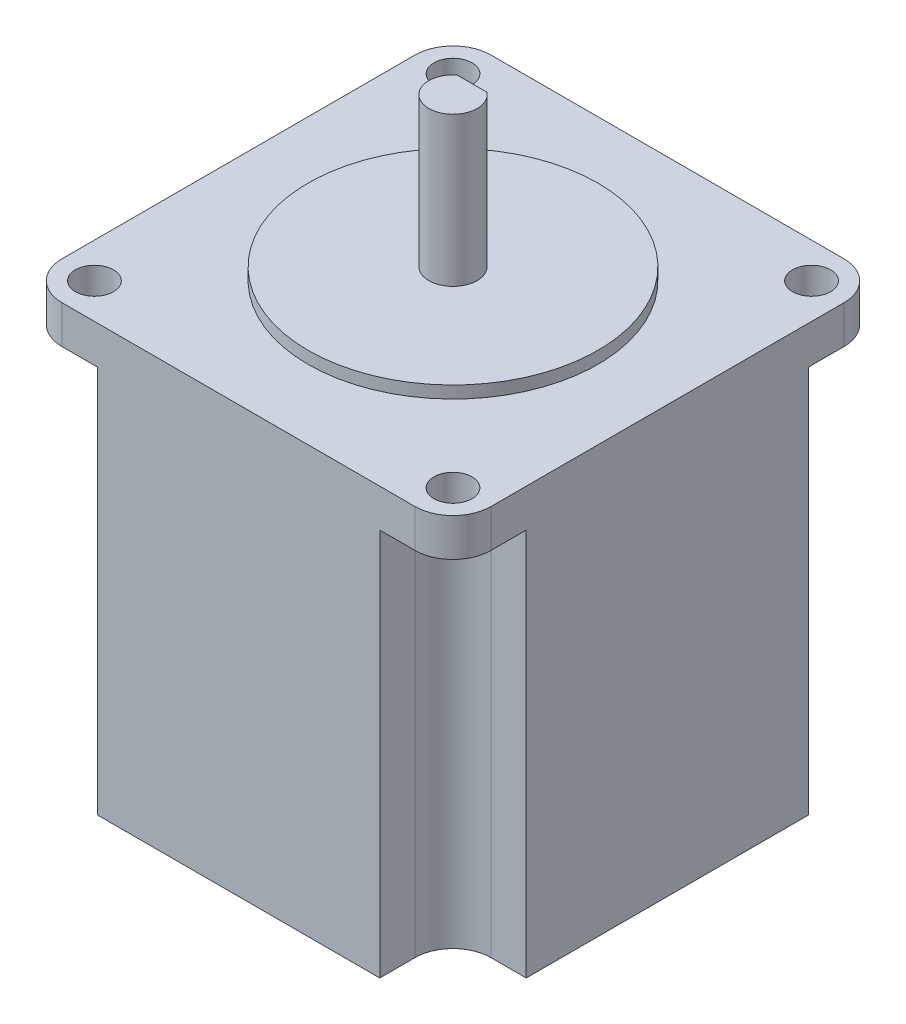
ISO-10303-21;
HEADER;
FILE_DESCRIPTION(('STEP AP214'),'2;1');
FILE_NAME('part.step','',(''),(''),'','','');
FILE_SCHEMA(('AUTOMOTIVE_DESIGN { 1 0 10303 214 1 1 1 1 }'));
ENDSEC;
DATA;
#1=APPLICATION_CONTEXT('core data for automotive mechanical design processes');
#2=APPLICATION_PROTOCOL_DEFINITION('international standard','automotive_design',2000,#1);
#3=PRODUCT_CONTEXT('',#1,'mechanical');
#4=PRODUCT('Part','Part','',(#3));
#5=PRODUCT_RELATED_PRODUCT_CATEGORY('part','',(#4));
#6=PRODUCT_DEFINITION_FORMATION('','',#4);
#7=PRODUCT_DEFINITION_CONTEXT('part definition',#1,'design');
#8=PRODUCT_DEFINITION('design','',#6,#7);
#9=PRODUCT_DEFINITION_SHAPE('','',#8);
#10=(LENGTH_UNIT() NAMED_UNIT(*) SI_UNIT(.MILLI.,.METRE.));
#11=(NAMED_UNIT(*) PLANE_ANGLE_UNIT() SI_UNIT($,.RADIAN.));
#12=(NAMED_UNIT(*) SI_UNIT($,.STERADIAN.) SOLID_ANGLE_UNIT());
#13=UNCERTAINTY_MEASURE_WITH_UNIT(LENGTH_MEASURE(1.E-05),#10,'distance_accuracy_value','');
#14=(GEOMETRIC_REPRESENTATION_CONTEXT(3) GLOBAL_UNCERTAINTY_ASSIGNED_CONTEXT((#13)) GLOBAL_UNIT_ASSIGNED_CONTEXT((#10,
#11,#12)) REPRESENTATION_CONTEXT('',''));
#15=CARTESIAN_POINT('',(0.,0.,0.));
#16=DIRECTION('',(0.,0.,1.));
#17=DIRECTION('',(1.,0.,0.));
#18=AXIS2_PLACEMENT_3D('',#15,#16,#17);
#19=CARTESIAN_POINT('',(-23.57,0.,-23.57));
#20=DIRECTION('',(0.,1.,0.));
#21=DIRECTION('',(0.,0.,1.));
#22=AXIS2_PLACEMENT_3D('',#19,#20,#21);
#23=CYLINDRICAL_SURFACE('',#22,2.5);
#24=CARTESIAN_POINT('',(-23.57,56.,-23.57));
#25=DIRECTION('',(0.,1.,0.));
#26=DIRECTION('',(0.,0.,1.));
#27=AXIS2_PLACEMENT_3D('',#24,#25,#26);
#28=CIRCLE('',#27,2.5);
#29=CARTESIAN_POINT('',(-23.57,56.,-21.07));
#30=VERTEX_POINT('',#29);
#31=EDGE_CURVE('E369',#30,#30,#28,.T.);
#32=ORIENTED_EDGE('',*,*,#31,.T.);
#33=EDGE_LOOP('',(#32));
#34=FACE_BOUND('',#33,.T.);
#35=CARTESIAN_POINT('',(-23.57,51.,-23.57));
#36=DIRECTION('',(0.,-1.,0.));
#37=DIRECTION('',(0.,0.,-1.));
#38=AXIS2_PLACEMENT_3D('',#35,#36,#37);
#39=CIRCLE('',#38,2.5);
#40=CARTESIAN_POINT('',(-23.57,51.,-26.07));
#41=VERTEX_POINT('',#40);
#42=EDGE_CURVE('E376',#41,#41,#39,.F.);
#43=ORIENTED_EDGE('',*,*,#42,.F.);
#44=EDGE_LOOP('',(#43));
#45=FACE_BOUND('',#44,.T.);
#46=ADVANCED_FACE('F42',(#34,#45),#23,.F.);
#47=CARTESIAN_POINT('',(23.57,0.,-23.57));
#48=DIRECTION('',(0.,1.,0.));
#49=DIRECTION('',(0.,0.,1.));
#50=AXIS2_PLACEMENT_3D('',#47,#48,#49);
#51=CYLINDRICAL_SURFACE('',#50,2.5);
#52=CARTESIAN_POINT('',(23.57,56.,-23.57));
#53=DIRECTION('',(0.,1.,0.));
#54=DIRECTION('',(0.,0.,1.));
#55=AXIS2_PLACEMENT_3D('',#52,#53,#54);
#56=CIRCLE('',#55,2.5);
#57=CARTESIAN_POINT('',(23.57,56.,-21.07));
#58=VERTEX_POINT('',#57);
#59=EDGE_CURVE('E366',#58,#58,#56,.T.);
#60=ORIENTED_EDGE('',*,*,#59,.T.);
#61=EDGE_LOOP('',(#60));
#62=FACE_BOUND('',#61,.T.);
#63=CARTESIAN_POINT('',(23.57,51.,-23.57));
#64=DIRECTION('',(0.,-1.,0.));
#65=DIRECTION('',(0.,0.,-1.));
#66=AXIS2_PLACEMENT_3D('',#63,#64,#65);
#67=CIRCLE('',#66,2.5);
#68=CARTESIAN_POINT('',(23.57,51.,-26.07));
#69=VERTEX_POINT('',#68);
#70=EDGE_CURVE('E409',#69,#69,#67,.F.);
#71=ORIENTED_EDGE('',*,*,#70,.F.);
#72=EDGE_LOOP('',(#71));
#73=FACE_BOUND('',#72,.T.);
#74=ADVANCED_FACE('F550',(#62,#73),#51,.F.);
#75=CARTESIAN_POINT('',(23.57,0.,23.57));
#76=DIRECTION('',(0.,1.,0.));
#77=DIRECTION('',(0.,0.,1.));
#78=AXIS2_PLACEMENT_3D('',#75,#76,#77);
#79=CYLINDRICAL_SURFACE('',#78,2.5);
#80=CARTESIAN_POINT('',(23.57,56.,23.57));
#81=DIRECTION('',(0.,1.,0.));
#82=DIRECTION('',(0.,0.,1.));
#83=AXIS2_PLACEMENT_3D('',#80,#81,#82);
#84=CIRCLE('',#83,2.5);
#85=CARTESIAN_POINT('',(23.57,56.,26.07));
#86=VERTEX_POINT('',#85);
#87=EDGE_CURVE('E370',#86,#86,#84,.T.);
#88=ORIENTED_EDGE('',*,*,#87,.T.);
#89=EDGE_LOOP('',(#88));
#90=FACE_BOUND('',#89,.T.);
#91=CARTESIAN_POINT('',(23.57,51.,23.57));
#92=DIRECTION('',(0.,-1.,0.));
#93=DIRECTION('',(0.,0.,-1.));
#94=AXIS2_PLACEMENT_3D('',#91,#92,#93);
#95=CIRCLE('',#94,2.5);
#96=CARTESIAN_POINT('',(23.57,51.,21.07));
#97=VERTEX_POINT('',#96);
#98=EDGE_CURVE('E406',#97,#97,#95,.F.);
#99=ORIENTED_EDGE('',*,*,#98,.F.);
#100=EDGE_LOOP('',(#99));
#101=FACE_BOUND('',#100,.T.);
#102=ADVANCED_FACE('F556',(#90,#101),#79,.F.);
#103=CARTESIAN_POINT('',(-23.57,0.,23.57));
#104=DIRECTION('',(0.,1.,0.));
#105=DIRECTION('',(0.,0.,1.));
#106=AXIS2_PLACEMENT_3D('',#103,#104,#105);
#107=CYLINDRICAL_SURFACE('',#106,2.5);
#108=CARTESIAN_POINT('',(-23.57,56.,23.57));
#109=DIRECTION('',(0.,1.,0.));
#110=DIRECTION('',(0.,0.,1.));
#111=AXIS2_PLACEMENT_3D('',#108,#109,#110);
#112=CIRCLE('',#111,2.5);
#113=CARTESIAN_POINT('',(-23.57,56.,26.07));
#114=VERTEX_POINT('',#113);
#115=EDGE_CURVE('E373',#114,#114,#112,.T.);
#116=ORIENTED_EDGE('',*,*,#115,.T.);
#117=EDGE_LOOP('',(#116));
#118=FACE_BOUND('',#117,.T.);
#119=CARTESIAN_POINT('',(-23.57,51.,23.57));
#120=DIRECTION('',(0.,-1.,0.));
#121=DIRECTION('',(0.,0.,-1.));
#122=AXIS2_PLACEMENT_3D('',#119,#120,#121);
#123=CIRCLE('',#122,2.5);
#124=CARTESIAN_POINT('',(-23.57,51.,21.07));
#125=VERTEX_POINT('',#124);
#126=EDGE_CURVE('E360',#125,#125,#123,.F.);
#127=ORIENTED_EDGE('',*,*,#126,.F.);
#128=EDGE_LOOP('',(#127));
#129=FACE_BOUND('',#128,.T.);
#130=ADVANCED_FACE('F561',(#118,#129),#107,.F.);
#131=CARTESIAN_POINT('',(28.2,56.,28.2));
#132=DIRECTION('',(-1.,0.,0.));
#133=DIRECTION('',(0.,0.,1.));
#134=AXIS2_PLACEMENT_3D('',#131,#132,#133);
#135=PLANE('',#134);
#136=DIRECTION('',(0.,0.,1.));
#137=VECTOR('',#136,1.);
#138=CARTESIAN_POINT('',(28.2,51.,-18.57));
#139=LINE('',#138,#137);
#140=CARTESIAN_POINT('',(28.2,51.,-23.2));
#141=VERTEX_POINT('',#140);
#142=CARTESIAN_POINT('',(28.2,51.,-18.57));
#143=VERTEX_POINT('',#142);
#144=EDGE_CURVE('E318',#141,#143,#139,.T.);
#145=ORIENTED_EDGE('',*,*,#144,.F.);
#146=DIRECTION('',(0.,-1.,0.));
#147=VECTOR('',#146,1.);
#148=CARTESIAN_POINT('',(28.2,56.,-23.2));
#149=LINE('',#148,#147);
#150=CARTESIAN_POINT('',(28.2,56.,-23.2));
#151=VERTEX_POINT('',#150);
#152=EDGE_CURVE('E423',#141,#151,#149,.F.);
#153=ORIENTED_EDGE('',*,*,#152,.T.);
#154=DIRECTION('',(0.,0.,-1.));
#155=VECTOR('',#154,1.);
#156=CARTESIAN_POINT('',(28.2,56.,28.2));
#157=LINE('',#156,#155);
#158=CARTESIAN_POINT('',(28.2,56.,23.2));
#159=VERTEX_POINT('',#158);
#160=EDGE_CURVE('E380',#159,#151,#157,.T.);
#161=ORIENTED_EDGE('',*,*,#160,.F.);
#162=DIRECTION('',(0.,-1.,0.));
#163=VECTOR('',#162,1.);
#164=CARTESIAN_POINT('',(28.2,56.,23.2));
#165=LINE('',#164,#163);
#166=CARTESIAN_POINT('',(28.2,51.,23.2));
#167=VERTEX_POINT('',#166);
#168=EDGE_CURVE('E420',#159,#167,#165,.T.);
#169=ORIENTED_EDGE('',*,*,#168,.T.);
#170=DIRECTION('',(0.,0.,1.));
#171=VECTOR('',#170,1.);
#172=CARTESIAN_POINT('',(28.2,51.,28.2));
#173=LINE('',#172,#171);
#174=CARTESIAN_POINT('',(28.2,51.,18.57));
#175=VERTEX_POINT('',#174);
#176=EDGE_CURVE('E347',#175,#167,#173,.T.);
#177=ORIENTED_EDGE('',*,*,#176,.F.);
#178=DIRECTION('',(0.,-1.,0.));
#179=VECTOR('',#178,1.);
#180=CARTESIAN_POINT('',(28.2,51.,18.57));
#181=LINE('',#180,#179);
#182=CARTESIAN_POINT('',(28.2,0.,18.57));
#183=VERTEX_POINT('',#182);
#184=EDGE_CURVE('E357',#175,#183,#181,.T.);
#185=ORIENTED_EDGE('',*,*,#184,.T.);
#186=DIRECTION('',(0.,0.,-1.));
#187=VECTOR('',#186,1.);
#188=CARTESIAN_POINT('',(28.2,0.,28.2));
#189=LINE('',#188,#187);
#190=CARTESIAN_POINT('',(28.2,0.,-18.57));
#191=VERTEX_POINT('',#190);
#192=EDGE_CURVE('E379',#183,#191,#189,.T.);
#193=ORIENTED_EDGE('',*,*,#192,.T.);
#194=DIRECTION('',(0.,-1.,0.));
#195=VECTOR('',#194,1.);
#196=CARTESIAN_POINT('',(28.2,51.,-18.57));
#197=LINE('',#196,#195);
#198=EDGE_CURVE('E306',#143,#191,#197,.T.);
#199=ORIENTED_EDGE('',*,*,#198,.F.);
#200=EDGE_LOOP('',(#145,#153,#161,#169,#177,#185,#193,#199));
#201=FACE_BOUND('',#200,.T.);
#202=ADVANCED_FACE('F522',(#201),#135,.F.);
#203=CARTESIAN_POINT('',(-28.2,56.,-28.2));
#204=DIRECTION('',(0.,0.,1.));
#205=DIRECTION('',(1.,0.,0.));
#206=AXIS2_PLACEMENT_3D('',#203,#204,#205);
#207=PLANE('',#206);
#208=DIRECTION('',(-1.,0.,0.));
#209=VECTOR('',#208,1.);
#210=CARTESIAN_POINT('',(-28.2,56.,-28.2));
#211=LINE('',#210,#209);
#212=CARTESIAN_POINT('',(23.2,56.,-28.2));
#213=VERTEX_POINT('',#212);
#214=CARTESIAN_POINT('',(-23.2,56.,-28.2));
#215=VERTEX_POINT('',#214);
#216=EDGE_CURVE('E383',#213,#215,#211,.T.);
#217=ORIENTED_EDGE('',*,*,#216,.F.);
#218=DIRECTION('',(0.,-1.,0.));
#219=VECTOR('',#218,1.);
#220=CARTESIAN_POINT('',(23.2,56.,-28.2));
#221=LINE('',#220,#219);
#222=CARTESIAN_POINT('',(23.2,51.,-28.2));
#223=VERTEX_POINT('',#222);
#224=EDGE_CURVE('E415',#213,#223,#221,.T.);
#225=ORIENTED_EDGE('',*,*,#224,.T.);
#226=DIRECTION('',(1.,0.,0.));
#227=VECTOR('',#226,1.);
#228=CARTESIAN_POINT('',(28.2,51.,-28.2));
#229=LINE('',#228,#227);
#230=CARTESIAN_POINT('',(18.57,51.,-28.2));
#231=VERTEX_POINT('',#230);
#232=EDGE_CURVE('E308',#231,#223,#229,.T.);
#233=ORIENTED_EDGE('',*,*,#232,.F.);
#234=DIRECTION('',(0.,-1.,0.));
#235=VECTOR('',#234,1.);
#236=CARTESIAN_POINT('',(18.57,51.,-28.2));
#237=LINE('',#236,#235);
#238=CARTESIAN_POINT('',(18.57,0.,-28.2));
#239=VERTEX_POINT('',#238);
#240=EDGE_CURVE('E260',#231,#239,#237,.T.);
#241=ORIENTED_EDGE('',*,*,#240,.T.);
#242=DIRECTION('',(-1.,0.,0.));
#243=VECTOR('',#242,1.);
#244=CARTESIAN_POINT('',(-28.2,0.,-28.2));
#245=LINE('',#244,#243);
#246=CARTESIAN_POINT('',(-18.57,0.,-28.2));
#247=VERTEX_POINT('',#246);
#248=EDGE_CURVE('E396',#239,#247,#245,.T.);
#249=ORIENTED_EDGE('',*,*,#248,.T.);
#250=DIRECTION('',(0.,-1.,0.));
#251=VECTOR('',#250,1.);
#252=CARTESIAN_POINT('',(-18.57,51.,-28.2));
#253=LINE('',#252,#251);
#254=CARTESIAN_POINT('',(-18.57,51.,-28.2));
#255=VERTEX_POINT('',#254);
#256=EDGE_CURVE('E242',#255,#247,#253,.T.);
#257=ORIENTED_EDGE('',*,*,#256,.F.);
#258=DIRECTION('',(1.,0.,0.));
#259=VECTOR('',#258,1.);
#260=CARTESIAN_POINT('',(-18.57,51.,-28.2));
#261=LINE('',#260,#259);
#262=CARTESIAN_POINT('',(-23.2,51.,-28.2));
#263=VERTEX_POINT('',#262);
#264=EDGE_CURVE('E254',#263,#255,#261,.T.);
#265=ORIENTED_EDGE('',*,*,#264,.F.);
#266=DIRECTION('',(0.,-1.,0.));
#267=VECTOR('',#266,1.);
#268=CARTESIAN_POINT('',(-23.2,56.,-28.2));
#269=LINE('',#268,#267);
#270=EDGE_CURVE('E393',#263,#215,#269,.F.);
#271=ORIENTED_EDGE('',*,*,#270,.T.);
#272=EDGE_LOOP('',(#217,#225,#233,#241,#249,#257,#265,#271));
#273=FACE_BOUND('',#272,.T.);
#274=ADVANCED_FACE('F478',(#273),#207,.F.);
#275=CARTESIAN_POINT('',(-28.2,56.,28.2));
#276=DIRECTION('',(1.,0.,0.));
#277=DIRECTION('',(0.,0.,-1.));
#278=AXIS2_PLACEMENT_3D('',#275,#276,#277);
#279=PLANE('',#278);
#280=DIRECTION('',(0.,0.,1.));
#281=VECTOR('',#280,1.);
#282=CARTESIAN_POINT('',(-28.2,56.,28.2));
#283=LINE('',#282,#281);
#284=CARTESIAN_POINT('',(-28.2,56.,-23.2));
#285=VERTEX_POINT('',#284);
#286=CARTESIAN_POINT('',(-28.2,56.,23.2));
#287=VERTEX_POINT('',#286);
#288=EDGE_CURVE('E387',#285,#287,#283,.T.);
#289=ORIENTED_EDGE('',*,*,#288,.F.);
#290=DIRECTION('',(0.,-1.,0.));
#291=VECTOR('',#290,1.);
#292=CARTESIAN_POINT('',(-28.2,56.,-23.2));
#293=LINE('',#292,#291);
#294=CARTESIAN_POINT('',(-28.2,51.,-23.2));
#295=VERTEX_POINT('',#294);
#296=EDGE_CURVE('E435',#285,#295,#293,.T.);
#297=ORIENTED_EDGE('',*,*,#296,.T.);
#298=DIRECTION('',(0.,0.,-1.));
#299=VECTOR('',#298,1.);
#300=CARTESIAN_POINT('',(-28.2,51.,-28.2));
#301=LINE('',#300,#299);
#302=CARTESIAN_POINT('',(-28.2,51.,-18.57));
#303=VERTEX_POINT('',#302);
#304=EDGE_CURVE('E244',#303,#295,#301,.T.);
#305=ORIENTED_EDGE('',*,*,#304,.F.);
#306=DIRECTION('',(0.,-1.,0.));
#307=VECTOR('',#306,1.);
#308=CARTESIAN_POINT('',(-28.2,51.,-18.57));
#309=LINE('',#308,#307);
#310=CARTESIAN_POINT('',(-28.2,0.,-18.57));
#311=VERTEX_POINT('',#310);
#312=EDGE_CURVE('E241',#303,#311,#309,.T.);
#313=ORIENTED_EDGE('',*,*,#312,.T.);
#314=DIRECTION('',(0.,0.,1.));
#315=VECTOR('',#314,1.);
#316=CARTESIAN_POINT('',(-28.2,0.,28.2));
#317=LINE('',#316,#315);
#318=CARTESIAN_POINT('',(-28.2,0.,18.57));
#319=VERTEX_POINT('',#318);
#320=EDGE_CURVE('E399',#311,#319,#317,.T.);
#321=ORIENTED_EDGE('',*,*,#320,.T.);
#322=DIRECTION('',(0.,-1.,0.));
#323=VECTOR('',#322,1.);
#324=CARTESIAN_POINT('',(-28.2,51.,18.57));
#325=LINE('',#324,#323);
#326=CARTESIAN_POINT('',(-28.2,51.,18.57));
#327=VERTEX_POINT('',#326);
#328=EDGE_CURVE('E273',#327,#319,#325,.T.);
#329=ORIENTED_EDGE('',*,*,#328,.F.);
#330=DIRECTION('',(0.,0.,-1.));
#331=VECTOR('',#330,1.);
#332=CARTESIAN_POINT('',(-28.2,51.,18.57));
#333=LINE('',#332,#331);
#334=CARTESIAN_POINT('',(-28.2,51.,23.2));
#335=VERTEX_POINT('',#334);
#336=EDGE_CURVE('E302',#335,#327,#333,.T.);
#337=ORIENTED_EDGE('',*,*,#336,.F.);
#338=DIRECTION('',(0.,-1.,0.));
#339=VECTOR('',#338,1.);
#340=CARTESIAN_POINT('',(-28.2,56.,23.2));
#341=LINE('',#340,#339);
#342=EDGE_CURVE('E433',#335,#287,#341,.F.);
#343=ORIENTED_EDGE('',*,*,#342,.T.);
#344=EDGE_LOOP('',(#289,#297,#305,#313,#321,#329,#337,#343));
#345=FACE_BOUND('',#344,.T.);
#346=ADVANCED_FACE('F510',(#345),#279,.F.);
#347=CARTESIAN_POINT('',(-28.2,56.,28.2));
#348=DIRECTION('',(0.,0.,-1.));
#349=DIRECTION('',(-1.,0.,0.));
#350=AXIS2_PLACEMENT_3D('',#347,#348,#349);
#351=PLANE('',#350);
#352=DIRECTION('',(-1.,0.,0.));
#353=VECTOR('',#352,1.);
#354=CARTESIAN_POINT('',(18.57,51.,28.2));
#355=LINE('',#354,#353);
#356=CARTESIAN_POINT('',(23.2,51.,28.2));
#357=VERTEX_POINT('',#356);
#358=CARTESIAN_POINT('',(18.57,51.,28.2));
#359=VERTEX_POINT('',#358);
#360=EDGE_CURVE('E335',#357,#359,#355,.T.);
#361=ORIENTED_EDGE('',*,*,#360,.F.);
#362=DIRECTION('',(0.,-1.,0.));
#363=VECTOR('',#362,1.);
#364=CARTESIAN_POINT('',(23.2,56.,28.2));
#365=LINE('',#364,#363);
#366=CARTESIAN_POINT('',(23.2,56.,28.2));
#367=VERTEX_POINT('',#366);
#368=EDGE_CURVE('E444',#357,#367,#365,.F.);
#369=ORIENTED_EDGE('',*,*,#368,.T.);
#370=DIRECTION('',(1.,0.,0.));
#371=VECTOR('',#370,1.);
#372=CARTESIAN_POINT('',(-28.2,56.,28.2));
#373=LINE('',#372,#371);
#374=CARTESIAN_POINT('',(-23.2,56.,28.2));
#375=VERTEX_POINT('',#374);
#376=EDGE_CURVE('E390',#375,#367,#373,.T.);
#377=ORIENTED_EDGE('',*,*,#376,.F.);
#378=DIRECTION('',(0.,-1.,0.));
#379=VECTOR('',#378,1.);
#380=CARTESIAN_POINT('',(-23.2,56.,28.2));
#381=LINE('',#380,#379);
#382=CARTESIAN_POINT('',(-23.2,51.,28.2));
#383=VERTEX_POINT('',#382);
#384=EDGE_CURVE('E442',#375,#383,#381,.T.);
#385=ORIENTED_EDGE('',*,*,#384,.T.);
#386=DIRECTION('',(-1.,0.,0.));
#387=VECTOR('',#386,1.);
#388=CARTESIAN_POINT('',(-28.2,51.,28.2));
#389=LINE('',#388,#387);
#390=CARTESIAN_POINT('',(-18.57,51.,28.2));
#391=VERTEX_POINT('',#390);
#392=EDGE_CURVE('E287',#391,#383,#389,.T.);
#393=ORIENTED_EDGE('',*,*,#392,.F.);
#394=DIRECTION('',(0.,-1.,0.));
#395=VECTOR('',#394,1.);
#396=CARTESIAN_POINT('',(-18.57,51.,28.2));
#397=LINE('',#396,#395);
#398=CARTESIAN_POINT('',(-18.57,0.,28.2));
#399=VERTEX_POINT('',#398);
#400=EDGE_CURVE('E280',#391,#399,#397,.T.);
#401=ORIENTED_EDGE('',*,*,#400,.T.);
#402=DIRECTION('',(1.,0.,0.));
#403=VECTOR('',#402,1.);
#404=CARTESIAN_POINT('',(-28.2,0.,28.2));
#405=LINE('',#404,#403);
#406=CARTESIAN_POINT('',(18.57,0.,28.2));
#407=VERTEX_POINT('',#406);
#408=EDGE_CURVE('E384',#399,#407,#405,.T.);
#409=ORIENTED_EDGE('',*,*,#408,.T.);
#410=DIRECTION('',(0.,-1.,0.));
#411=VECTOR('',#410,1.);
#412=CARTESIAN_POINT('',(18.57,51.,28.2));
#413=LINE('',#412,#411);
#414=EDGE_CURVE('E350',#359,#407,#413,.T.);
#415=ORIENTED_EDGE('',*,*,#414,.F.);
#416=EDGE_LOOP('',(#361,#369,#377,#385,#393,#401,#409,#415));
#417=FACE_BOUND('',#416,.T.);
#418=ADVANCED_FACE('F456',(#417),#351,.F.);
#419=CARTESIAN_POINT('',(0.,56.,0.));
#420=DIRECTION('',(0.,-1.,0.));
#421=DIRECTION('',(0.,0.,-1.));
#422=AXIS2_PLACEMENT_3D('',#419,#420,#421);
#423=PLANE('',#422);
#424=CARTESIAN_POINT('',(0.,56.,0.));
#425=DIRECTION('',(0.,-1.,0.));
#426=DIRECTION('',(0.,0.,-1.));
#427=AXIS2_PLACEMENT_3D('',#424,#425,#426);
#428=CIRCLE('',#427,19.05);
#429=CARTESIAN_POINT('',(0.,56.,-19.05));
#430=VERTEX_POINT('',#429);
#431=EDGE_CURVE('E46',#430,#430,#428,.F.);
#432=ORIENTED_EDGE('',*,*,#431,.F.);
#433=EDGE_LOOP('',(#432));
#434=FACE_BOUND('',#433,.T.);
#435=ORIENTED_EDGE('',*,*,#115,.F.);
#436=EDGE_LOOP('',(#435));
#437=FACE_BOUND('',#436,.T.);
#438=ORIENTED_EDGE('',*,*,#87,.F.);
#439=EDGE_LOOP('',(#438));
#440=FACE_BOUND('',#439,.T.);
#441=ORIENTED_EDGE('',*,*,#59,.F.);
#442=EDGE_LOOP('',(#441));
#443=FACE_BOUND('',#442,.T.);
#444=ORIENTED_EDGE('',*,*,#31,.F.);
#445=EDGE_LOOP('',(#444));
#446=FACE_BOUND('',#445,.T.);
#447=ORIENTED_EDGE('',*,*,#160,.T.);
#448=CARTESIAN_POINT('',(23.2,56.,-23.2));
#449=DIRECTION('',(0.,-1.,0.));
#450=DIRECTION('',(0.,0.,-1.));
#451=AXIS2_PLACEMENT_3D('',#448,#449,#450);
#452=CIRCLE('',#451,5.);
#453=EDGE_CURVE('E431',#151,#213,#452,.F.);
#454=ORIENTED_EDGE('',*,*,#453,.T.);
#455=ORIENTED_EDGE('',*,*,#216,.T.);
#456=CARTESIAN_POINT('',(-23.2,56.,-23.2));
#457=DIRECTION('',(0.,-1.,0.));
#458=DIRECTION('',(0.,0.,-1.));
#459=AXIS2_PLACEMENT_3D('',#456,#457,#458);
#460=CIRCLE('',#459,5.);
#461=EDGE_CURVE('E429',#215,#285,#460,.F.);
#462=ORIENTED_EDGE('',*,*,#461,.T.);
#463=ORIENTED_EDGE('',*,*,#288,.T.);
#464=CARTESIAN_POINT('',(-23.2,56.,23.2));
#465=DIRECTION('',(0.,-1.,0.));
#466=DIRECTION('',(0.,0.,-1.));
#467=AXIS2_PLACEMENT_3D('',#464,#465,#466);
#468=CIRCLE('',#467,5.);
#469=EDGE_CURVE('E425',#287,#375,#468,.F.);
#470=ORIENTED_EDGE('',*,*,#469,.T.);
#471=ORIENTED_EDGE('',*,*,#376,.T.);
#472=CARTESIAN_POINT('',(23.2,56.,23.2));
#473=DIRECTION('',(0.,-1.,0.));
#474=DIRECTION('',(0.,0.,-1.));
#475=AXIS2_PLACEMENT_3D('',#472,#473,#474);
#476=CIRCLE('',#475,5.);
#477=EDGE_CURVE('E427',#367,#159,#476,.F.);
#478=ORIENTED_EDGE('',*,*,#477,.T.);
#479=EDGE_LOOP('',(#447,#454,#455,#462,#463,#470,#471,#478));
#480=FACE_BOUND('',#479,.T.);
#481=ADVANCED_FACE('F452',(#434,#437,#440,#443,#446,#480),#423,.F.);
#482=CARTESIAN_POINT('',(0.,0.,0.));
#483=DIRECTION('',(0.,-1.,0.));
#484=DIRECTION('',(0.,0.,-1.));
#485=AXIS2_PLACEMENT_3D('',#482,#483,#484);
#486=PLANE('',#485);
#487=DIRECTION('',(0.,0.,1.));
#488=VECTOR('',#487,1.);
#489=CARTESIAN_POINT('',(-18.57,0.,23.57));
#490=LINE('',#489,#488);
#491=CARTESIAN_POINT('',(-18.57,0.,23.57));
#492=VERTEX_POINT('',#491);
#493=EDGE_CURVE('E284',#492,#399,#490,.T.);
#494=ORIENTED_EDGE('',*,*,#493,.F.);
#495=CARTESIAN_POINT('',(-23.57,0.,23.57));
#496=DIRECTION('',(0.,-1.,0.));
#497=DIRECTION('',(0.,0.,-1.));
#498=AXIS2_PLACEMENT_3D('',#495,#496,#497);
#499=CIRCLE('',#498,5.);
#500=CARTESIAN_POINT('',(-23.57,0.,18.57));
#501=VERTEX_POINT('',#500);
#502=EDGE_CURVE('E286',#501,#492,#499,.T.);
#503=ORIENTED_EDGE('',*,*,#502,.F.);
#504=DIRECTION('',(1.,0.,0.));
#505=VECTOR('',#504,1.);
#506=CARTESIAN_POINT('',(-23.57,0.,18.57));
#507=LINE('',#506,#505);
#508=EDGE_CURVE('E290',#319,#501,#507,.T.);
#509=ORIENTED_EDGE('',*,*,#508,.F.);
#510=ORIENTED_EDGE('',*,*,#320,.F.);
#511=DIRECTION('',(-1.,0.,0.));
#512=VECTOR('',#511,1.);
#513=CARTESIAN_POINT('',(-23.57,0.,-18.57));
#514=LINE('',#513,#512);
#515=CARTESIAN_POINT('',(-23.57,0.,-18.57));
#516=VERTEX_POINT('',#515);
#517=EDGE_CURVE('E251',#516,#311,#514,.T.);
#518=ORIENTED_EDGE('',*,*,#517,.F.);
#519=CARTESIAN_POINT('',(-23.57,0.,-23.57));
#520=DIRECTION('',(0.,-1.,0.));
#521=DIRECTION('',(0.,0.,-1.));
#522=AXIS2_PLACEMENT_3D('',#519,#520,#521);
#523=CIRCLE('',#522,5.);
#524=CARTESIAN_POINT('',(-18.57,0.,-23.57));
#525=VERTEX_POINT('',#524);
#526=EDGE_CURVE('E253',#525,#516,#523,.T.);
#527=ORIENTED_EDGE('',*,*,#526,.F.);
#528=DIRECTION('',(0.,0.,1.));
#529=VECTOR('',#528,1.);
#530=CARTESIAN_POINT('',(-18.57,0.,-23.57));
#531=LINE('',#530,#529);
#532=EDGE_CURVE('E257',#247,#525,#531,.T.);
#533=ORIENTED_EDGE('',*,*,#532,.F.);
#534=ORIENTED_EDGE('',*,*,#248,.F.);
#535=DIRECTION('',(0.,0.,-1.));
#536=VECTOR('',#535,1.);
#537=CARTESIAN_POINT('',(18.57,0.,-23.57));
#538=LINE('',#537,#536);
#539=CARTESIAN_POINT('',(18.57,0.,-23.57));
#540=VERTEX_POINT('',#539);
#541=EDGE_CURVE('E315',#540,#239,#538,.T.);
#542=ORIENTED_EDGE('',*,*,#541,.F.);
#543=CARTESIAN_POINT('',(23.57,0.,-23.57));
#544=DIRECTION('',(0.,-1.,0.));
#545=DIRECTION('',(0.,0.,-1.));
#546=AXIS2_PLACEMENT_3D('',#543,#544,#545);
#547=CIRCLE('',#546,5.);
#548=CARTESIAN_POINT('',(23.57,0.,-18.57));
#549=VERTEX_POINT('',#548);
#550=EDGE_CURVE('E317',#549,#540,#547,.T.);
#551=ORIENTED_EDGE('',*,*,#550,.F.);
#552=DIRECTION('',(-1.,0.,0.));
#553=VECTOR('',#552,1.);
#554=CARTESIAN_POINT('',(23.57,0.,-18.57));
#555=LINE('',#554,#553);
#556=EDGE_CURVE('E283',#191,#549,#555,.T.);
#557=ORIENTED_EDGE('',*,*,#556,.F.);
#558=ORIENTED_EDGE('',*,*,#192,.F.);
#559=DIRECTION('',(1.,0.,0.));
#560=VECTOR('',#559,1.);
#561=CARTESIAN_POINT('',(23.57,0.,18.57));
#562=LINE('',#561,#560);
#563=CARTESIAN_POINT('',(23.57,0.,18.57));
#564=VERTEX_POINT('',#563);
#565=EDGE_CURVE('E338',#564,#183,#562,.T.);
#566=ORIENTED_EDGE('',*,*,#565,.F.);
#567=CARTESIAN_POINT('',(23.57,0.,23.57));
#568=DIRECTION('',(0.,-1.,0.));
#569=DIRECTION('',(0.,0.,-1.));
#570=AXIS2_PLACEMENT_3D('',#567,#568,#569);
#571=CIRCLE('',#570,5.);
#572=CARTESIAN_POINT('',(18.57,0.,23.57));
#573=VERTEX_POINT('',#572);
#574=EDGE_CURVE('E353',#573,#564,#571,.T.);
#575=ORIENTED_EDGE('',*,*,#574,.F.);
#576=DIRECTION('',(0.,0.,-1.));
#577=VECTOR('',#576,1.);
#578=CARTESIAN_POINT('',(18.57,0.,23.57));
#579=LINE('',#578,#577);
#580=EDGE_CURVE('E293',#407,#573,#579,.T.);
#581=ORIENTED_EDGE('',*,*,#580,.F.);
#582=ORIENTED_EDGE('',*,*,#408,.F.);
#583=EDGE_LOOP('',(#494,#503,#509,#510,#518,#527,#533,#534,#542,#551,#557,#558,#566,#575,#581,#582));
#584=FACE_BOUND('',#583,.T.);
#585=ADVANCED_FACE('F455',(#584),#486,.T.);
#586=CARTESIAN_POINT('',(-23.57,51.,23.57));
#587=DIRECTION('',(0.,-1.,0.));
#588=DIRECTION('',(0.,0.,-1.));
#589=AXIS2_PLACEMENT_3D('',#586,#587,#588);
#590=PLANE('',#589);
#591=ORIENTED_EDGE('',*,*,#392,.T.);
#592=CARTESIAN_POINT('',(-23.2,51.,23.2));
#593=DIRECTION('',(0.,-1.,0.));
#594=DIRECTION('',(0.,0.,-1.));
#595=AXIS2_PLACEMENT_3D('',#592,#593,#594);
#596=CIRCLE('',#595,5.);
#597=EDGE_CURVE('E66',#383,#335,#596,.T.);
#598=ORIENTED_EDGE('',*,*,#597,.T.);
#599=ORIENTED_EDGE('',*,*,#336,.T.);
#600=DIRECTION('',(1.,0.,0.));
#601=VECTOR('',#600,1.);
#602=CARTESIAN_POINT('',(-23.57,51.,18.57));
#603=LINE('',#602,#601);
#604=CARTESIAN_POINT('',(-23.57,51.,18.57));
#605=VERTEX_POINT('',#604);
#606=EDGE_CURVE('E299',#327,#605,#603,.T.);
#607=ORIENTED_EDGE('',*,*,#606,.T.);
#608=CARTESIAN_POINT('',(-23.57,51.,23.57));
#609=DIRECTION('',(0.,-1.,0.));
#610=DIRECTION('',(0.,0.,-1.));
#611=AXIS2_PLACEMENT_3D('',#608,#609,#610);
#612=CIRCLE('',#611,5.);
#613=CARTESIAN_POINT('',(-18.57,51.,23.57));
#614=VERTEX_POINT('',#613);
#615=EDGE_CURVE('E296',#605,#614,#612,.T.);
#616=ORIENTED_EDGE('',*,*,#615,.T.);
#617=DIRECTION('',(0.,0.,1.));
#618=VECTOR('',#617,1.);
#619=CARTESIAN_POINT('',(-18.57,51.,23.57));
#620=LINE('',#619,#618);
#621=EDGE_CURVE('E275',#614,#391,#620,.T.);
#622=ORIENTED_EDGE('',*,*,#621,.T.);
#623=EDGE_LOOP('',(#591,#598,#599,#607,#616,#622));
#624=FACE_BOUND('',#623,.T.);
#625=ORIENTED_EDGE('',*,*,#126,.T.);
#626=EDGE_LOOP('',(#625));
#627=FACE_BOUND('',#626,.T.);
#628=ADVANCED_FACE('F566',(#624,#627),#590,.T.);
#629=CARTESIAN_POINT('',(-18.57,51.,23.57));
#630=DIRECTION('',(1.,0.,0.));
#631=DIRECTION('',(0.,0.,-1.));
#632=AXIS2_PLACEMENT_3D('',#629,#630,#631);
#633=PLANE('',#632);
#634=ORIENTED_EDGE('',*,*,#493,.T.);
#635=ORIENTED_EDGE('',*,*,#400,.F.);
#636=ORIENTED_EDGE('',*,*,#621,.F.);
#637=DIRECTION('',(0.,-1.,0.));
#638=VECTOR('',#637,1.);
#639=CARTESIAN_POINT('',(-18.57,51.,23.57));
#640=LINE('',#639,#638);
#641=EDGE_CURVE('E278',#614,#492,#640,.T.);
#642=ORIENTED_EDGE('',*,*,#641,.T.);
#643=EDGE_LOOP('',(#634,#635,#636,#642));
#644=FACE_BOUND('',#643,.T.);
#645=ADVANCED_FACE('F615',(#644),#633,.F.);
#646=CARTESIAN_POINT('',(-23.57,51.,23.57));
#647=DIRECTION('',(0.,-1.,0.));
#648=DIRECTION('',(0.,0.,-1.));
#649=AXIS2_PLACEMENT_3D('',#646,#647,#648);
#650=CYLINDRICAL_SURFACE('',#649,5.);
#651=ORIENTED_EDGE('',*,*,#502,.T.);
#652=ORIENTED_EDGE('',*,*,#641,.F.);
#653=ORIENTED_EDGE('',*,*,#615,.F.);
#654=DIRECTION('',(0.,-1.,0.));
#655=VECTOR('',#654,1.);
#656=CARTESIAN_POINT('',(-23.57,51.,18.57));
#657=LINE('',#656,#655);
#658=EDGE_CURVE('E276',#605,#501,#657,.T.);
#659=ORIENTED_EDGE('',*,*,#658,.T.);
#660=EDGE_LOOP('',(#651,#652,#653,#659));
#661=FACE_BOUND('',#660,.T.);
#662=ADVANCED_FACE('F611',(#661),#650,.F.);
#663=CARTESIAN_POINT('',(-23.57,51.,18.57));
#664=DIRECTION('',(0.,0.,-1.));
#665=DIRECTION('',(-1.,0.,0.));
#666=AXIS2_PLACEMENT_3D('',#663,#664,#665);
#667=PLANE('',#666);
#668=ORIENTED_EDGE('',*,*,#508,.T.);
#669=ORIENTED_EDGE('',*,*,#658,.F.);
#670=ORIENTED_EDGE('',*,*,#606,.F.);
#671=ORIENTED_EDGE('',*,*,#328,.T.);
#672=EDGE_LOOP('',(#668,#669,#670,#671));
#673=FACE_BOUND('',#672,.T.);
#674=ADVANCED_FACE('F608',(#673),#667,.F.);
#675=CARTESIAN_POINT('',(23.57,51.,23.57));
#676=DIRECTION('',(0.,-1.,0.));
#677=DIRECTION('',(0.,0.,-1.));
#678=AXIS2_PLACEMENT_3D('',#675,#676,#677);
#679=PLANE('',#678);
#680=ORIENTED_EDGE('',*,*,#176,.T.);
#681=CARTESIAN_POINT('',(23.2,51.,23.2));
#682=DIRECTION('',(0.,-1.,0.));
#683=DIRECTION('',(0.,0.,-1.));
#684=AXIS2_PLACEMENT_3D('',#681,#682,#683);
#685=CIRCLE('',#684,5.);
#686=EDGE_CURVE('E440',#167,#357,#685,.T.);
#687=ORIENTED_EDGE('',*,*,#686,.T.);
#688=ORIENTED_EDGE('',*,*,#360,.T.);
#689=DIRECTION('',(0.,0.,-1.));
#690=VECTOR('',#689,1.);
#691=CARTESIAN_POINT('',(18.57,51.,23.57));
#692=LINE('',#691,#690);
#693=CARTESIAN_POINT('',(18.57,51.,23.57));
#694=VERTEX_POINT('',#693);
#695=EDGE_CURVE('E337',#359,#694,#692,.T.);
#696=ORIENTED_EDGE('',*,*,#695,.T.);
#697=CARTESIAN_POINT('',(23.57,51.,23.57));
#698=DIRECTION('',(0.,-1.,0.));
#699=DIRECTION('',(0.,0.,-1.));
#700=AXIS2_PLACEMENT_3D('',#697,#698,#699);
#701=CIRCLE('',#700,5.);
#702=CARTESIAN_POINT('',(23.57,51.,18.57));
#703=VERTEX_POINT('',#702);
#704=EDGE_CURVE('E341',#694,#703,#701,.T.);
#705=ORIENTED_EDGE('',*,*,#704,.T.);
#706=DIRECTION('',(1.,0.,0.));
#707=VECTOR('',#706,1.);
#708=CARTESIAN_POINT('',(23.57,51.,18.57));
#709=LINE('',#708,#707);
#710=EDGE_CURVE('E344',#703,#175,#709,.T.);
#711=ORIENTED_EDGE('',*,*,#710,.T.);
#712=EDGE_LOOP('',(#680,#687,#688,#696,#705,#711));
#713=FACE_BOUND('',#712,.T.);
#714=ORIENTED_EDGE('',*,*,#98,.T.);
#715=EDGE_LOOP('',(#714));
#716=FACE_BOUND('',#715,.T.);
#717=ADVANCED_FACE('F524',(#713,#716),#679,.T.);
#718=CARTESIAN_POINT('',(23.57,51.,18.57));
#719=DIRECTION('',(0.,0.,-1.));
#720=DIRECTION('',(-1.,0.,0.));
#721=AXIS2_PLACEMENT_3D('',#718,#719,#720);
#722=PLANE('',#721);
#723=ORIENTED_EDGE('',*,*,#565,.T.);
#724=ORIENTED_EDGE('',*,*,#184,.F.);
#725=ORIENTED_EDGE('',*,*,#710,.F.);
#726=DIRECTION('',(0.,-1.,0.));
#727=VECTOR('',#726,1.);
#728=CARTESIAN_POINT('',(23.57,51.,18.57));
#729=LINE('',#728,#727);
#730=EDGE_CURVE('E361',#703,#564,#729,.T.);
#731=ORIENTED_EDGE('',*,*,#730,.T.);
#732=EDGE_LOOP('',(#723,#724,#725,#731));
#733=FACE_BOUND('',#732,.T.);
#734=ADVANCED_FACE('F529',(#733),#722,.F.);
#735=CARTESIAN_POINT('',(23.57,51.,23.57));
#736=DIRECTION('',(0.,-1.,0.));
#737=DIRECTION('',(0.,0.,-1.));
#738=AXIS2_PLACEMENT_3D('',#735,#736,#737);
#739=CYLINDRICAL_SURFACE('',#738,5.);
#740=ORIENTED_EDGE('',*,*,#574,.T.);
#741=ORIENTED_EDGE('',*,*,#730,.F.);
#742=ORIENTED_EDGE('',*,*,#704,.F.);
#743=DIRECTION('',(0.,-1.,0.));
#744=VECTOR('',#743,1.);
#745=CARTESIAN_POINT('',(18.57,51.,23.57));
#746=LINE('',#745,#744);
#747=EDGE_CURVE('E363',#694,#573,#746,.T.);
#748=ORIENTED_EDGE('',*,*,#747,.T.);
#749=EDGE_LOOP('',(#740,#741,#742,#748));
#750=FACE_BOUND('',#749,.T.);
#751=ADVANCED_FACE('F639',(#750),#739,.F.);
#752=CARTESIAN_POINT('',(18.57,51.,23.57));
#753=DIRECTION('',(-1.,0.,0.));
#754=DIRECTION('',(0.,0.,1.));
#755=AXIS2_PLACEMENT_3D('',#752,#753,#754);
#756=PLANE('',#755);
#757=ORIENTED_EDGE('',*,*,#580,.T.);
#758=ORIENTED_EDGE('',*,*,#747,.F.);
#759=ORIENTED_EDGE('',*,*,#695,.F.);
#760=ORIENTED_EDGE('',*,*,#414,.T.);
#761=EDGE_LOOP('',(#757,#758,#759,#760));
#762=FACE_BOUND('',#761,.T.);
#763=ADVANCED_FACE('F636',(#762),#756,.F.);
#764=CARTESIAN_POINT('',(23.57,51.,-23.57));
#765=DIRECTION('',(0.,-1.,0.));
#766=DIRECTION('',(0.,0.,-1.));
#767=AXIS2_PLACEMENT_3D('',#764,#765,#766);
#768=PLANE('',#767);
#769=ORIENTED_EDGE('',*,*,#232,.T.);
#770=CARTESIAN_POINT('',(23.2,51.,-23.2));
#771=DIRECTION('',(0.,-1.,0.));
#772=DIRECTION('',(0.,0.,-1.));
#773=AXIS2_PLACEMENT_3D('',#770,#771,#772);
#774=CIRCLE('',#773,5.);
#775=EDGE_CURVE('E418',#223,#141,#774,.T.);
#776=ORIENTED_EDGE('',*,*,#775,.T.);
#777=ORIENTED_EDGE('',*,*,#144,.T.);
#778=DIRECTION('',(-1.,0.,0.));
#779=VECTOR('',#778,1.);
#780=CARTESIAN_POINT('',(23.57,51.,-18.57));
#781=LINE('',#780,#779);
#782=CARTESIAN_POINT('',(23.57,51.,-18.57));
#783=VERTEX_POINT('',#782);
#784=EDGE_CURVE('E331',#143,#783,#781,.T.);
#785=ORIENTED_EDGE('',*,*,#784,.T.);
#786=CARTESIAN_POINT('',(23.57,51.,-23.57));
#787=DIRECTION('',(0.,-1.,0.));
#788=DIRECTION('',(0.,0.,-1.));
#789=AXIS2_PLACEMENT_3D('',#786,#787,#788);
#790=CIRCLE('',#789,5.);
#791=CARTESIAN_POINT('',(18.57,51.,-23.57));
#792=VERTEX_POINT('',#791);
#793=EDGE_CURVE('E328',#783,#792,#790,.T.);
#794=ORIENTED_EDGE('',*,*,#793,.T.);
#795=DIRECTION('',(0.,0.,-1.));
#796=VECTOR('',#795,1.);
#797=CARTESIAN_POINT('',(18.57,51.,-23.57));
#798=LINE('',#797,#796);
#799=EDGE_CURVE('E325',#792,#231,#798,.T.);
#800=ORIENTED_EDGE('',*,*,#799,.T.);
#801=EDGE_LOOP('',(#769,#776,#777,#785,#794,#800));
#802=FACE_BOUND('',#801,.T.);
#803=ORIENTED_EDGE('',*,*,#70,.T.);
#804=EDGE_LOOP('',(#803));
#805=FACE_BOUND('',#804,.T.);
#806=ADVANCED_FACE('F480',(#802,#805),#768,.T.);
#807=CARTESIAN_POINT('',(18.57,51.,-23.57));
#808=DIRECTION('',(-1.,0.,0.));
#809=DIRECTION('',(0.,0.,1.));
#810=AXIS2_PLACEMENT_3D('',#807,#808,#809);
#811=PLANE('',#810);
#812=ORIENTED_EDGE('',*,*,#541,.T.);
#813=ORIENTED_EDGE('',*,*,#240,.F.);
#814=ORIENTED_EDGE('',*,*,#799,.F.);
#815=DIRECTION('',(0.,-1.,0.));
#816=VECTOR('',#815,1.);
#817=CARTESIAN_POINT('',(18.57,51.,-23.57));
#818=LINE('',#817,#816);
#819=EDGE_CURVE('E311',#792,#540,#818,.T.);
#820=ORIENTED_EDGE('',*,*,#819,.T.);
#821=EDGE_LOOP('',(#812,#813,#814,#820));
#822=FACE_BOUND('',#821,.T.);
#823=ADVANCED_FACE('F486',(#822),#811,.F.);
#824=CARTESIAN_POINT('',(23.57,51.,-23.57));
#825=DIRECTION('',(0.,-1.,0.));
#826=DIRECTION('',(0.,0.,-1.));
#827=AXIS2_PLACEMENT_3D('',#824,#825,#826);
#828=CYLINDRICAL_SURFACE('',#827,5.);
#829=ORIENTED_EDGE('',*,*,#550,.T.);
#830=ORIENTED_EDGE('',*,*,#819,.F.);
#831=ORIENTED_EDGE('',*,*,#793,.F.);
#832=DIRECTION('',(0.,-1.,0.));
#833=VECTOR('',#832,1.);
#834=CARTESIAN_POINT('',(23.57,51.,-18.57));
#835=LINE('',#834,#833);
#836=EDGE_CURVE('E309',#783,#549,#835,.T.);
#837=ORIENTED_EDGE('',*,*,#836,.T.);
#838=EDGE_LOOP('',(#829,#830,#831,#837));
#839=FACE_BOUND('',#838,.T.);
#840=ADVANCED_FACE('F539',(#839),#828,.F.);
#841=CARTESIAN_POINT('',(23.57,51.,-18.57));
#842=DIRECTION('',(0.,0.,1.));
#843=DIRECTION('',(1.,0.,0.));
#844=AXIS2_PLACEMENT_3D('',#841,#842,#843);
#845=PLANE('',#844);
#846=ORIENTED_EDGE('',*,*,#556,.T.);
#847=ORIENTED_EDGE('',*,*,#836,.F.);
#848=ORIENTED_EDGE('',*,*,#784,.F.);
#849=ORIENTED_EDGE('',*,*,#198,.T.);
#850=EDGE_LOOP('',(#846,#847,#848,#849));
#851=FACE_BOUND('',#850,.T.);
#852=ADVANCED_FACE('F536',(#851),#845,.F.);
#853=CARTESIAN_POINT('',(-23.57,51.,-23.57));
#854=DIRECTION('',(0.,-1.,0.));
#855=DIRECTION('',(0.,0.,-1.));
#856=AXIS2_PLACEMENT_3D('',#853,#854,#855);
#857=PLANE('',#856);
#858=ORIENTED_EDGE('',*,*,#304,.T.);
#859=CARTESIAN_POINT('',(-23.2,51.,-23.2));
#860=DIRECTION('',(0.,-1.,0.));
#861=DIRECTION('',(0.,0.,-1.));
#862=AXIS2_PLACEMENT_3D('',#859,#860,#861);
#863=CIRCLE('',#862,5.);
#864=EDGE_CURVE('E438',#295,#263,#863,.T.);
#865=ORIENTED_EDGE('',*,*,#864,.T.);
#866=ORIENTED_EDGE('',*,*,#264,.T.);
#867=DIRECTION('',(0.,0.,1.));
#868=VECTOR('',#867,1.);
#869=CARTESIAN_POINT('',(-18.57,51.,-23.57));
#870=LINE('',#869,#868);
#871=CARTESIAN_POINT('',(-18.57,51.,-23.57));
#872=VERTEX_POINT('',#871);
#873=EDGE_CURVE('E269',#255,#872,#870,.T.);
#874=ORIENTED_EDGE('',*,*,#873,.T.);
#875=CARTESIAN_POINT('',(-23.57,51.,-23.57));
#876=DIRECTION('',(0.,-1.,0.));
#877=DIRECTION('',(0.,0.,-1.));
#878=AXIS2_PLACEMENT_3D('',#875,#876,#877);
#879=CIRCLE('',#878,5.);
#880=CARTESIAN_POINT('',(-23.57,51.,-18.57));
#881=VERTEX_POINT('',#880);
#882=EDGE_CURVE('E266',#872,#881,#879,.T.);
#883=ORIENTED_EDGE('',*,*,#882,.T.);
#884=DIRECTION('',(-1.,0.,0.));
#885=VECTOR('',#884,1.);
#886=CARTESIAN_POINT('',(-23.57,51.,-18.57));
#887=LINE('',#886,#885);
#888=EDGE_CURVE('E263',#881,#303,#887,.T.);
#889=ORIENTED_EDGE('',*,*,#888,.T.);
#890=EDGE_LOOP('',(#858,#865,#866,#874,#883,#889));
#891=FACE_BOUND('',#890,.T.);
#892=ORIENTED_EDGE('',*,*,#42,.T.);
#893=EDGE_LOOP('',(#892));
#894=FACE_BOUND('',#893,.T.);
#895=ADVANCED_FACE('F546',(#891,#894),#857,.T.);
#896=CARTESIAN_POINT('',(-23.57,51.,-18.57));
#897=DIRECTION('',(0.,0.,1.));
#898=DIRECTION('',(1.,0.,0.));
#899=AXIS2_PLACEMENT_3D('',#896,#897,#898);
#900=PLANE('',#899);
#901=ORIENTED_EDGE('',*,*,#517,.T.);
#902=ORIENTED_EDGE('',*,*,#312,.F.);
#903=ORIENTED_EDGE('',*,*,#888,.F.);
#904=DIRECTION('',(0.,-1.,0.));
#905=VECTOR('',#904,1.);
#906=CARTESIAN_POINT('',(-23.57,51.,-18.57));
#907=LINE('',#906,#905);
#908=EDGE_CURVE('E247',#881,#516,#907,.T.);
#909=ORIENTED_EDGE('',*,*,#908,.T.);
#910=EDGE_LOOP('',(#901,#902,#903,#909));
#911=FACE_BOUND('',#910,.T.);
#912=ADVANCED_FACE('F601',(#911),#900,.F.);
#913=CARTESIAN_POINT('',(-23.57,51.,-23.57));
#914=DIRECTION('',(0.,-1.,0.));
#915=DIRECTION('',(0.,0.,-1.));
#916=AXIS2_PLACEMENT_3D('',#913,#914,#915);
#917=CYLINDRICAL_SURFACE('',#916,5.);
#918=ORIENTED_EDGE('',*,*,#526,.T.);
#919=ORIENTED_EDGE('',*,*,#908,.F.);
#920=ORIENTED_EDGE('',*,*,#882,.F.);
#921=DIRECTION('',(0.,-1.,0.));
#922=VECTOR('',#921,1.);
#923=CARTESIAN_POINT('',(-18.57,51.,-23.57));
#924=LINE('',#923,#922);
#925=EDGE_CURVE('E245',#872,#525,#924,.T.);
#926=ORIENTED_EDGE('',*,*,#925,.T.);
#927=EDGE_LOOP('',(#918,#919,#920,#926));
#928=FACE_BOUND('',#927,.T.);
#929=ADVANCED_FACE('F598',(#928),#917,.F.);
#930=CARTESIAN_POINT('',(-18.57,51.,-23.57));
#931=DIRECTION('',(1.,0.,0.));
#932=DIRECTION('',(0.,0.,-1.));
#933=AXIS2_PLACEMENT_3D('',#930,#931,#932);
#934=PLANE('',#933);
#935=ORIENTED_EDGE('',*,*,#532,.T.);
#936=ORIENTED_EDGE('',*,*,#925,.F.);
#937=ORIENTED_EDGE('',*,*,#873,.F.);
#938=ORIENTED_EDGE('',*,*,#256,.T.);
#939=EDGE_LOOP('',(#935,#936,#937,#938));
#940=FACE_BOUND('',#939,.T.);
#941=ADVANCED_FACE('F497',(#940),#934,.F.);
#942=CARTESIAN_POINT('',(23.2,56.,-23.2));
#943=DIRECTION('',(0.,-1.,0.));
#944=DIRECTION('',(0.,0.,-1.));
#945=AXIS2_PLACEMENT_3D('',#942,#943,#944);
#946=CYLINDRICAL_SURFACE('',#945,5.);
#947=ORIENTED_EDGE('',*,*,#453,.F.);
#948=ORIENTED_EDGE('',*,*,#152,.F.);
#949=ORIENTED_EDGE('',*,*,#775,.F.);
#950=ORIENTED_EDGE('',*,*,#224,.F.);
#951=EDGE_LOOP('',(#947,#948,#949,#950));
#952=FACE_BOUND('',#951,.T.);
#953=ADVANCED_FACE('F475',(#952),#946,.T.);
#954=CARTESIAN_POINT('',(-23.2,56.,-23.2));
#955=DIRECTION('',(0.,-1.,0.));
#956=DIRECTION('',(0.,0.,-1.));
#957=AXIS2_PLACEMENT_3D('',#954,#955,#956);
#958=CYLINDRICAL_SURFACE('',#957,5.);
#959=ORIENTED_EDGE('',*,*,#461,.F.);
#960=ORIENTED_EDGE('',*,*,#270,.F.);
#961=ORIENTED_EDGE('',*,*,#864,.F.);
#962=ORIENTED_EDGE('',*,*,#296,.F.);
#963=EDGE_LOOP('',(#959,#960,#961,#962));
#964=FACE_BOUND('',#963,.T.);
#965=ADVANCED_FACE('F505',(#964),#958,.T.);
#966=CARTESIAN_POINT('',(23.2,56.,23.2));
#967=DIRECTION('',(0.,-1.,0.));
#968=DIRECTION('',(0.,0.,-1.));
#969=AXIS2_PLACEMENT_3D('',#966,#967,#968);
#970=CYLINDRICAL_SURFACE('',#969,5.);
#971=ORIENTED_EDGE('',*,*,#477,.F.);
#972=ORIENTED_EDGE('',*,*,#368,.F.);
#973=ORIENTED_EDGE('',*,*,#686,.F.);
#974=ORIENTED_EDGE('',*,*,#168,.F.);
#975=EDGE_LOOP('',(#971,#972,#973,#974));
#976=FACE_BOUND('',#975,.T.);
#977=ADVANCED_FACE('F520',(#976),#970,.T.);
#978=CARTESIAN_POINT('',(-23.2,56.,23.2));
#979=DIRECTION('',(0.,-1.,0.));
#980=DIRECTION('',(0.,0.,-1.));
#981=AXIS2_PLACEMENT_3D('',#978,#979,#980);
#982=CYLINDRICAL_SURFACE('',#981,5.);
#983=ORIENTED_EDGE('',*,*,#469,.F.);
#984=ORIENTED_EDGE('',*,*,#342,.F.);
#985=ORIENTED_EDGE('',*,*,#597,.F.);
#986=ORIENTED_EDGE('',*,*,#384,.F.);
#987=EDGE_LOOP('',(#983,#984,#985,#986));
#988=FACE_BOUND('',#987,.T.);
#989=ADVANCED_FACE('F44',(#988),#982,.T.);
#990=CARTESIAN_POINT('',(0.,57.6,0.));
#991=DIRECTION('',(0.,-1.,0.));
#992=DIRECTION('',(0.,0.,-1.));
#993=AXIS2_PLACEMENT_3D('',#990,#991,#992);
#994=CYLINDRICAL_SURFACE('',#993,19.05);
#995=CARTESIAN_POINT('',(0.,57.6,0.));
#996=DIRECTION('',(0.,1.,0.));
#997=DIRECTION('',(0.,0.,1.));
#998=AXIS2_PLACEMENT_3D('',#995,#996,#997);
#999=CIRCLE('',#998,19.05);
#1000=CARTESIAN_POINT('',(0.,57.6,19.05));
#1001=VERTEX_POINT('',#1000);
#1002=EDGE_CURVE('E237',#1001,#1001,#999,.T.);
#1003=ORIENTED_EDGE('',*,*,#1002,.F.);
#1004=EDGE_LOOP('',(#1003));
#1005=FACE_BOUND('',#1004,.T.);
#1006=ORIENTED_EDGE('',*,*,#431,.T.);
#1007=EDGE_LOOP('',(#1006));
#1008=FACE_BOUND('',#1007,.T.);
#1009=ADVANCED_FACE('F450',(#1005,#1008),#994,.T.);
#1010=CARTESIAN_POINT('',(0.,57.6,0.));
#1011=DIRECTION('',(0.,1.,0.));
#1012=DIRECTION('',(0.,0.,1.));
#1013=AXIS2_PLACEMENT_3D('',#1010,#1011,#1012);
#1014=PLANE('',#1013);
#1015=CARTESIAN_POINT('',(0.,57.6,0.));
#1016=DIRECTION('',(0.,1.,0.));
#1017=DIRECTION('',(0.,0.,1.));
#1018=AXIS2_PLACEMENT_3D('',#1015,#1016,#1017);
#1019=CIRCLE('',#1018,3.175);
#1020=CARTESIAN_POINT('',(0.,57.6,3.175));
#1021=VERTEX_POINT('',#1020);
#1022=EDGE_CURVE('E11',#1021,#1021,#1019,.T.);
#1023=ORIENTED_EDGE('',*,*,#1022,.F.);
#1024=EDGE_LOOP('',(#1023));
#1025=FACE_BOUND('',#1024,.T.);
#1026=ORIENTED_EDGE('',*,*,#1002,.T.);
#1027=EDGE_LOOP('',(#1026));
#1028=FACE_BOUND('',#1027,.T.);
#1029=ADVANCED_FACE('F585',(#1025,#1028),#1014,.T.);
#1030=CARTESIAN_POINT('',(0.,77.2,0.));
#1031=DIRECTION('',(0.,-1.,0.));
#1032=DIRECTION('',(0.,0.,-1.));
#1033=AXIS2_PLACEMENT_3D('',#1030,#1031,#1032);
#1034=CYLINDRICAL_SURFACE('',#1033,3.175);
#1035=CARTESIAN_POINT('',(0.,77.2,0.));
#1036=DIRECTION('',(0.,1.,0.));
#1037=DIRECTION('',(0.,0.,1.));
#1038=AXIS2_PLACEMENT_3D('',#1035,#1036,#1037);
#1039=CIRCLE('',#1038,3.175);
#1040=CARTESIAN_POINT('',(-1.96356818063443,77.2,-2.495));
#1041=VERTEX_POINT('',#1040);
#1042=CARTESIAN_POINT('',(1.96356818063443,77.2,-2.495));
#1043=VERTEX_POINT('',#1042);
#1044=EDGE_CURVE('E232',#1041,#1043,#1039,.T.);
#1045=ORIENTED_EDGE('',*,*,#1044,.F.);
#1046=DIRECTION('',(0.,1.,0.));
#1047=VECTOR('',#1046,1.);
#1048=CARTESIAN_POINT('',(-1.96356818063443,60.2,-2.495));
#1049=LINE('',#1048,#1047);
#1050=CARTESIAN_POINT('',(-1.96356818063443,60.2,-2.495));
#1051=VERTEX_POINT('',#1050);
#1052=EDGE_CURVE('E58',#1051,#1041,#1049,.T.);
#1053=ORIENTED_EDGE('',*,*,#1052,.F.);
#1054=CARTESIAN_POINT('',(0.,60.2,0.));
#1055=DIRECTION('',(0.,1.,0.));
#1056=DIRECTION('',(0.,0.,1.));
#1057=AXIS2_PLACEMENT_3D('',#1054,#1055,#1056);
#1058=CIRCLE('',#1057,3.175);
#1059=CARTESIAN_POINT('',(1.96356818063443,60.2,-2.495));
#1060=VERTEX_POINT('',#1059);
#1061=EDGE_CURVE('E218',#1060,#1051,#1058,.T.);
#1062=ORIENTED_EDGE('',*,*,#1061,.F.);
#1063=DIRECTION('',(0.,1.,0.));
#1064=VECTOR('',#1063,1.);
#1065=CARTESIAN_POINT('',(1.96356818063443,60.2,-2.495));
#1066=LINE('',#1065,#1064);
#1067=EDGE_CURVE('E226',#1060,#1043,#1066,.T.);
#1068=ORIENTED_EDGE('',*,*,#1067,.T.);
#1069=EDGE_LOOP('',(#1045,#1053,#1062,#1068));
#1070=FACE_BOUND('',#1069,.T.);
#1071=ORIENTED_EDGE('',*,*,#1022,.T.);
#1072=EDGE_LOOP('',(#1071));
#1073=FACE_BOUND('',#1072,.T.);
#1074=ADVANCED_FACE('F229',(#1070,#1073),#1034,.T.);
#1075=CARTESIAN_POINT('',(0.,77.2,0.));
#1076=DIRECTION('',(0.,1.,0.));
#1077=DIRECTION('',(0.,0.,1.));
#1078=AXIS2_PLACEMENT_3D('',#1075,#1076,#1077);
#1079=PLANE('',#1078);
#1080=DIRECTION('',(1.,0.,0.));
#1081=VECTOR('',#1080,1.);
#1082=CARTESIAN_POINT('',(-1.96356818063443,77.2,-2.495));
#1083=LINE('',#1082,#1081);
#1084=EDGE_CURVE('E223',#1041,#1043,#1083,.T.);
#1085=ORIENTED_EDGE('',*,*,#1084,.F.);
#1086=ORIENTED_EDGE('',*,*,#1044,.T.);
#1087=EDGE_LOOP('',(#1085,#1086));
#1088=FACE_BOUND('',#1087,.T.);
#1089=ADVANCED_FACE('F816',(#1088),#1079,.T.);
#1090=CARTESIAN_POINT('',(-1.96356818063443,60.2,-2.495));
#1091=DIRECTION('',(0.,0.,1.));
#1092=DIRECTION('',(1.,0.,0.));
#1093=AXIS2_PLACEMENT_3D('',#1090,#1091,#1092);
#1094=PLANE('',#1093);
#1095=ORIENTED_EDGE('',*,*,#1084,.T.);
#1096=ORIENTED_EDGE('',*,*,#1067,.F.);
#1097=DIRECTION('',(1.,0.,0.));
#1098=VECTOR('',#1097,1.);
#1099=CARTESIAN_POINT('',(-1.96356818063443,60.2,-2.495));
#1100=LINE('',#1099,#1098);
#1101=EDGE_CURVE('E220',#1051,#1060,#1100,.T.);
#1102=ORIENTED_EDGE('',*,*,#1101,.F.);
#1103=ORIENTED_EDGE('',*,*,#1052,.T.);
#1104=EDGE_LOOP('',(#1095,#1096,#1102,#1103));
#1105=FACE_BOUND('',#1104,.T.);
#1106=ADVANCED_FACE('F225',(#1105),#1094,.F.);
#1107=CARTESIAN_POINT('',(0.,60.2,0.));
#1108=DIRECTION('',(0.,1.,0.));
#1109=DIRECTION('',(0.,0.,1.));
#1110=AXIS2_PLACEMENT_3D('',#1107,#1108,#1109);
#1111=PLANE('',#1110);
#1112=ORIENTED_EDGE('',*,*,#1061,.T.);
#1113=ORIENTED_EDGE('',*,*,#1101,.T.);
#1114=EDGE_LOOP('',(#1112,#1113));
#1115=FACE_BOUND('',#1114,.T.);
#1116=ADVANCED_FACE('F219',(#1115),#1111,.T.);
#1117=CLOSED_SHELL('',(#46,#74,#102,#130,#202,#274,#346,#418,#481,#585,#628,#645,#662,#674,#717,
#734,#751,#763,#806,#823,#840,#852,#895,#912,#929,#941,#953,#965,#977,#989,#1009,#1029,#1074,
#1089,#1106,#1116));
#1118=MANIFOLD_SOLID_BREP('B2',#1117);
#1119=ADVANCED_BREP_SHAPE_REPRESENTATION('',(#18,#1118),#14);
#1120=SHAPE_DEFINITION_REPRESENTATION(#9,#1119);
ENDSEC;
END-ISO-10303-21;
